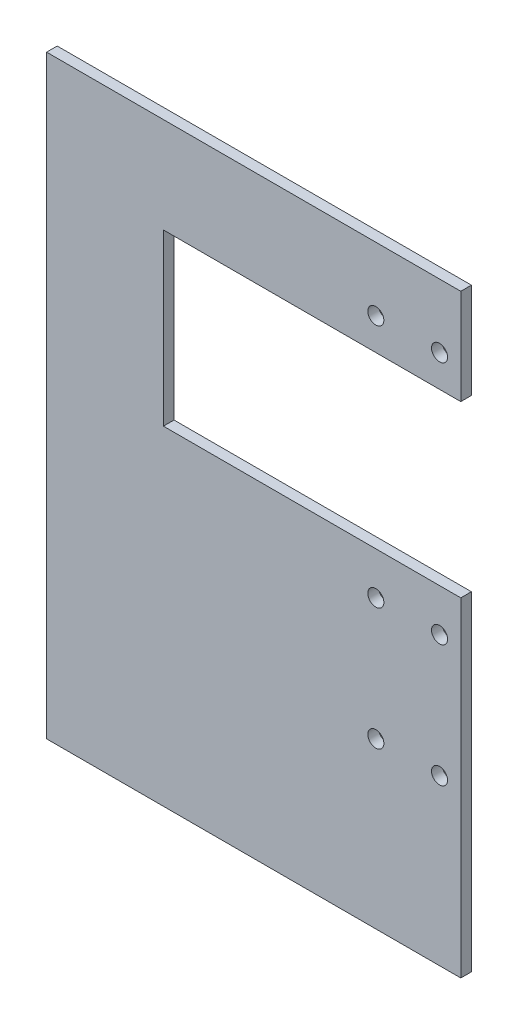
ISO-10303-21;
HEADER;
FILE_DESCRIPTION(('STEP AP214'),'2;1');
FILE_NAME('part.step','',(''),(''),'','','');
FILE_SCHEMA(('AUTOMOTIVE_DESIGN { 1 0 10303 214 1 1 1 1 }'));
ENDSEC;
DATA;
#1=APPLICATION_CONTEXT('core data for automotive mechanical design processes');
#2=APPLICATION_PROTOCOL_DEFINITION('international standard','automotive_design',2000,#1);
#3=PRODUCT_CONTEXT('',#1,'mechanical');
#4=PRODUCT('Part','Part','',(#3));
#5=PRODUCT_RELATED_PRODUCT_CATEGORY('part','',(#4));
#6=PRODUCT_DEFINITION_FORMATION('','',#4);
#7=PRODUCT_DEFINITION_CONTEXT('part definition',#1,'design');
#8=PRODUCT_DEFINITION('design','',#6,#7);
#9=PRODUCT_DEFINITION_SHAPE('','',#8);
#10=(LENGTH_UNIT() NAMED_UNIT(*) SI_UNIT(.MILLI.,.METRE.));
#11=(NAMED_UNIT(*) PLANE_ANGLE_UNIT() SI_UNIT($,.RADIAN.));
#12=(NAMED_UNIT(*) SI_UNIT($,.STERADIAN.) SOLID_ANGLE_UNIT());
#13=UNCERTAINTY_MEASURE_WITH_UNIT(LENGTH_MEASURE(1.E-05),#10,'distance_accuracy_value','');
#14=(GEOMETRIC_REPRESENTATION_CONTEXT(3) GLOBAL_UNCERTAINTY_ASSIGNED_CONTEXT((#13)) GLOBAL_UNIT_ASSIGNED_CONTEXT((#10,
#11,#12)) REPRESENTATION_CONTEXT('',''));
#15=CARTESIAN_POINT('',(0.,0.,0.));
#16=DIRECTION('',(0.,0.,1.));
#17=DIRECTION('',(1.,0.,0.));
#18=AXIS2_PLACEMENT_3D('',#15,#16,#17);
#19=CARTESIAN_POINT('',(0.,0.,0.));
#20=DIRECTION('',(0.,0.,1.));
#21=DIRECTION('',(1.,0.,0.));
#22=AXIS2_PLACEMENT_3D('',#19,#20,#21);
#23=PLANE('',#22);
#24=CARTESIAN_POINT('',(117.475,49.2124999999996,0.));
#25=DIRECTION('',(0.,0.,-1.));
#26=DIRECTION('',(-1.,0.,0.));
#27=AXIS2_PLACEMENT_3D('',#24,#25,#26);
#28=CIRCLE('',#27,2.40029999999999);
#29=CARTESIAN_POINT('',(115.0747,49.2124999999996,0.));
#30=VERTEX_POINT('',#29);
#31=EDGE_CURVE('E123',#30,#30,#28,.F.);
#32=ORIENTED_EDGE('',*,*,#31,.T.);
#33=EDGE_LOOP('',(#32));
#34=FACE_BOUND('',#33,.T.);
#35=CARTESIAN_POINT('',(98.425,49.2124999999997,0.));
#36=DIRECTION('',(0.,0.,-1.));
#37=DIRECTION('',(-1.,0.,0.));
#38=AXIS2_PLACEMENT_3D('',#35,#36,#37);
#39=CIRCLE('',#38,2.40029999999999);
#40=CARTESIAN_POINT('',(96.0247,49.2124999999997,0.));
#41=VERTEX_POINT('',#40);
#42=EDGE_CURVE('E20',#41,#41,#39,.F.);
#43=ORIENTED_EDGE('',*,*,#42,.T.);
#44=EDGE_LOOP('',(#43));
#45=FACE_BOUND('',#44,.T.);
#46=CARTESIAN_POINT('',(117.475,85.7250000000001,0.));
#47=DIRECTION('',(0.,0.,-1.));
#48=DIRECTION('',(-1.,0.,0.));
#49=AXIS2_PLACEMENT_3D('',#46,#47,#48);
#50=CIRCLE('',#49,2.40029999999999);
#51=CARTESIAN_POINT('',(115.0747,85.7250000000001,0.));
#52=VERTEX_POINT('',#51);
#53=EDGE_CURVE('E126',#52,#52,#50,.F.);
#54=ORIENTED_EDGE('',*,*,#53,.T.);
#55=EDGE_LOOP('',(#54));
#56=FACE_BOUND('',#55,.T.);
#57=CARTESIAN_POINT('',(98.425,85.7250000000001,0.));
#58=DIRECTION('',(0.,0.,-1.));
#59=DIRECTION('',(-1.,0.,0.));
#60=AXIS2_PLACEMENT_3D('',#57,#58,#59);
#61=CIRCLE('',#60,2.40029999999999);
#62=CARTESIAN_POINT('',(96.0247,85.7250000000001,0.));
#63=VERTEX_POINT('',#62);
#64=EDGE_CURVE('E134',#63,#63,#61,.F.);
#65=ORIENTED_EDGE('',*,*,#64,.T.);
#66=EDGE_LOOP('',(#65));
#67=FACE_BOUND('',#66,.T.);
#68=CARTESIAN_POINT('',(117.475,158.75,0.));
#69=DIRECTION('',(0.,0.,-1.));
#70=DIRECTION('',(-1.,0.,0.));
#71=AXIS2_PLACEMENT_3D('',#68,#69,#70);
#72=CIRCLE('',#71,2.40029999999999);
#73=CARTESIAN_POINT('',(115.0747,158.75,0.));
#74=VERTEX_POINT('',#73);
#75=EDGE_CURVE('E129',#74,#74,#72,.F.);
#76=ORIENTED_EDGE('',*,*,#75,.T.);
#77=EDGE_LOOP('',(#76));
#78=FACE_BOUND('',#77,.T.);
#79=CARTESIAN_POINT('',(98.425,158.75,0.));
#80=DIRECTION('',(0.,0.,-1.));
#81=DIRECTION('',(-1.,0.,0.));
#82=AXIS2_PLACEMENT_3D('',#79,#80,#81);
#83=CIRCLE('',#82,2.40029999999999);
#84=CARTESIAN_POINT('',(96.0247,158.75,0.));
#85=VERTEX_POINT('',#84);
#86=EDGE_CURVE('E93',#85,#85,#83,.F.);
#87=ORIENTED_EDGE('',*,*,#86,.T.);
#88=EDGE_LOOP('',(#87));
#89=FACE_BOUND('',#88,.T.);
#90=DIRECTION('',(0.,-1.,0.));
#91=VECTOR('',#90,1.);
#92=CARTESIAN_POINT('',(123.825,149.225,0.));
#93=LINE('',#92,#91);
#94=CARTESIAN_POINT('',(123.825,177.8,0.));
#95=VERTEX_POINT('',#94);
#96=CARTESIAN_POINT('',(123.825,149.225,0.));
#97=VERTEX_POINT('',#96);
#98=EDGE_CURVE('E132',#95,#97,#93,.T.);
#99=ORIENTED_EDGE('',*,*,#98,.T.);
#100=DIRECTION('',(1.,0.,0.));
#101=VECTOR('',#100,1.);
#102=CARTESIAN_POINT('',(123.825,149.225,0.));
#103=LINE('',#102,#101);
#104=CARTESIAN_POINT('',(34.925,149.225,0.));
#105=VERTEX_POINT('',#104);
#106=EDGE_CURVE('E340',#97,#105,#103,.F.);
#107=ORIENTED_EDGE('',*,*,#106,.T.);
#108=DIRECTION('',(0.,-1.,0.));
#109=VECTOR('',#108,1.);
#110=CARTESIAN_POINT('',(34.925,149.225,0.));
#111=LINE('',#110,#109);
#112=CARTESIAN_POINT('',(34.925,98.425,0.));
#113=VERTEX_POINT('',#112);
#114=EDGE_CURVE('E345',#105,#113,#111,.T.);
#115=ORIENTED_EDGE('',*,*,#114,.T.);
#116=DIRECTION('',(1.,0.,0.));
#117=VECTOR('',#116,1.);
#118=CARTESIAN_POINT('',(123.825,98.425,0.));
#119=LINE('',#118,#117);
#120=CARTESIAN_POINT('',(123.825,98.425,0.));
#121=VERTEX_POINT('',#120);
#122=EDGE_CURVE('E350',#113,#121,#119,.T.);
#123=ORIENTED_EDGE('',*,*,#122,.T.);
#124=DIRECTION('',(0.,1.,0.));
#125=VECTOR('',#124,1.);
#126=CARTESIAN_POINT('',(123.825,0.,0.));
#127=LINE('',#126,#125);
#128=CARTESIAN_POINT('',(123.825,0.,0.));
#129=VERTEX_POINT('',#128);
#130=EDGE_CURVE('E320',#121,#129,#127,.F.);
#131=ORIENTED_EDGE('',*,*,#130,.T.);
#132=DIRECTION('',(1.,0.,0.));
#133=VECTOR('',#132,1.);
#134=CARTESIAN_POINT('',(0.,0.,0.));
#135=LINE('',#134,#133);
#136=CARTESIAN_POINT('',(0.,0.,0.));
#137=VERTEX_POINT('',#136);
#138=EDGE_CURVE('E96',#129,#137,#135,.F.);
#139=ORIENTED_EDGE('',*,*,#138,.T.);
#140=DIRECTION('',(0.,1.,0.));
#141=VECTOR('',#140,1.);
#142=CARTESIAN_POINT('',(0.,98.425,0.));
#143=LINE('',#142,#141);
#144=CARTESIAN_POINT('',(0.,177.8,0.));
#145=VERTEX_POINT('',#144);
#146=EDGE_CURVE('E79',#137,#145,#143,.T.);
#147=ORIENTED_EDGE('',*,*,#146,.T.);
#148=DIRECTION('',(1.,0.,0.));
#149=VECTOR('',#148,1.);
#150=CARTESIAN_POINT('',(0.,177.8,0.));
#151=LINE('',#150,#149);
#152=EDGE_CURVE('E84',#145,#95,#151,.T.);
#153=ORIENTED_EDGE('',*,*,#152,.T.);
#154=EDGE_LOOP('',(#99,#107,#115,#123,#131,#139,#147,#153));
#155=FACE_BOUND('',#154,.T.);
#156=ADVANCED_FACE('F17',(#34,#45,#56,#67,#78,#89,#155),#23,.F.);
#157=CARTESIAN_POINT('',(98.425,49.2124999999997,3.175));
#158=DIRECTION('',(0.,0.,-1.));
#159=DIRECTION('',(-1.,0.,0.));
#160=AXIS2_PLACEMENT_3D('',#157,#158,#159);
#161=CYLINDRICAL_SURFACE('',#160,2.40029999999999);
#162=CARTESIAN_POINT('',(98.425,49.2124999999997,3.175));
#163=DIRECTION('',(0.,0.,-1.));
#164=DIRECTION('',(-1.,0.,0.));
#165=AXIS2_PLACEMENT_3D('',#162,#163,#164);
#166=CIRCLE('',#165,2.40029999999999);
#167=CARTESIAN_POINT('',(96.0247,49.2124999999997,3.175));
#168=VERTEX_POINT('',#167);
#169=EDGE_CURVE('E120',#168,#168,#166,.T.);
#170=ORIENTED_EDGE('',*,*,#169,.F.);
#171=EDGE_LOOP('',(#170));
#172=FACE_BOUND('',#171,.T.);
#173=ORIENTED_EDGE('',*,*,#42,.F.);
#174=EDGE_LOOP('',(#173));
#175=FACE_BOUND('',#174,.T.);
#176=ADVANCED_FACE('F143',(#172,#175),#161,.F.);
#177=CARTESIAN_POINT('',(98.425,85.7250000000001,3.175));
#178=DIRECTION('',(0.,0.,-1.));
#179=DIRECTION('',(-1.,0.,0.));
#180=AXIS2_PLACEMENT_3D('',#177,#178,#179);
#181=CYLINDRICAL_SURFACE('',#180,2.40029999999999);
#182=CARTESIAN_POINT('',(98.425,85.7250000000001,3.175));
#183=DIRECTION('',(0.,0.,-1.));
#184=DIRECTION('',(-1.,0.,0.));
#185=AXIS2_PLACEMENT_3D('',#182,#183,#184);
#186=CIRCLE('',#185,2.40029999999999);
#187=CARTESIAN_POINT('',(96.0247,85.7250000000001,3.175));
#188=VERTEX_POINT('',#187);
#189=EDGE_CURVE('E117',#188,#188,#186,.T.);
#190=ORIENTED_EDGE('',*,*,#189,.F.);
#191=EDGE_LOOP('',(#190));
#192=FACE_BOUND('',#191,.T.);
#193=ORIENTED_EDGE('',*,*,#64,.F.);
#194=EDGE_LOOP('',(#193));
#195=FACE_BOUND('',#194,.T.);
#196=ADVANCED_FACE('F145',(#192,#195),#181,.F.);
#197=CARTESIAN_POINT('',(98.425,158.75,3.175));
#198=DIRECTION('',(0.,0.,-1.));
#199=DIRECTION('',(-1.,0.,0.));
#200=AXIS2_PLACEMENT_3D('',#197,#198,#199);
#201=CYLINDRICAL_SURFACE('',#200,2.40029999999999);
#202=CARTESIAN_POINT('',(98.425,158.75,3.175));
#203=DIRECTION('',(0.,0.,-1.));
#204=DIRECTION('',(-1.,0.,0.));
#205=AXIS2_PLACEMENT_3D('',#202,#203,#204);
#206=CIRCLE('',#205,2.40029999999999);
#207=CARTESIAN_POINT('',(96.0247,158.75,3.175));
#208=VERTEX_POINT('',#207);
#209=EDGE_CURVE('E113',#208,#208,#206,.T.);
#210=ORIENTED_EDGE('',*,*,#209,.F.);
#211=EDGE_LOOP('',(#210));
#212=FACE_BOUND('',#211,.T.);
#213=ORIENTED_EDGE('',*,*,#86,.F.);
#214=EDGE_LOOP('',(#213));
#215=FACE_BOUND('',#214,.T.);
#216=ADVANCED_FACE('F152',(#212,#215),#201,.F.);
#217=CARTESIAN_POINT('',(0.,177.8,3.175));
#218=DIRECTION('',(0.,-1.,0.));
#219=DIRECTION('',(0.,0.,-1.));
#220=AXIS2_PLACEMENT_3D('',#217,#218,#219);
#221=PLANE('',#220);
#222=DIRECTION('',(0.,0.,-1.));
#223=VECTOR('',#222,1.);
#224=CARTESIAN_POINT('',(0.,177.8,3.175));
#225=LINE('',#224,#223);
#226=CARTESIAN_POINT('',(0.,177.8,3.175));
#227=VERTEX_POINT('',#226);
#228=EDGE_CURVE('E86',#145,#227,#225,.F.);
#229=ORIENTED_EDGE('',*,*,#228,.T.);
#230=DIRECTION('',(1.,0.,0.));
#231=VECTOR('',#230,1.);
#232=CARTESIAN_POINT('',(0.,177.8,3.175));
#233=LINE('',#232,#231);
#234=CARTESIAN_POINT('',(123.825,177.8,3.175));
#235=VERTEX_POINT('',#234);
#236=EDGE_CURVE('E116',#235,#227,#233,.F.);
#237=ORIENTED_EDGE('',*,*,#236,.F.);
#238=DIRECTION('',(0.,0.,1.));
#239=VECTOR('',#238,1.);
#240=CARTESIAN_POINT('',(123.825,177.8,3.175));
#241=LINE('',#240,#239);
#242=EDGE_CURVE('E89',#235,#95,#241,.F.);
#243=ORIENTED_EDGE('',*,*,#242,.T.);
#244=ORIENTED_EDGE('',*,*,#152,.F.);
#245=EDGE_LOOP('',(#229,#237,#243,#244));
#246=FACE_BOUND('',#245,.T.);
#247=ADVANCED_FACE('F85',(#246),#221,.F.);
#248=CARTESIAN_POINT('',(0.,98.425,3.175));
#249=DIRECTION('',(1.,0.,0.));
#250=DIRECTION('',(0.,0.,-1.));
#251=AXIS2_PLACEMENT_3D('',#248,#249,#250);
#252=PLANE('',#251);
#253=DIRECTION('',(0.,0.,1.));
#254=VECTOR('',#253,1.);
#255=CARTESIAN_POINT('',(0.,0.,3.175));
#256=LINE('',#255,#254);
#257=CARTESIAN_POINT('',(0.,0.,3.175));
#258=VERTEX_POINT('',#257);
#259=EDGE_CURVE('E98',#137,#258,#256,.T.);
#260=ORIENTED_EDGE('',*,*,#259,.T.);
#261=DIRECTION('',(0.,1.,0.));
#262=VECTOR('',#261,1.);
#263=CARTESIAN_POINT('',(0.,0.,3.175));
#264=LINE('',#263,#262);
#265=EDGE_CURVE('E102',#227,#258,#264,.F.);
#266=ORIENTED_EDGE('',*,*,#265,.F.);
#267=ORIENTED_EDGE('',*,*,#228,.F.);
#268=ORIENTED_EDGE('',*,*,#146,.F.);
#269=EDGE_LOOP('',(#260,#266,#267,#268));
#270=FACE_BOUND('',#269,.T.);
#271=ADVANCED_FACE('F100',(#270),#252,.F.);
#272=CARTESIAN_POINT('',(0.,0.,3.175));
#273=DIRECTION('',(0.,1.,0.));
#274=DIRECTION('',(0.,0.,1.));
#275=AXIS2_PLACEMENT_3D('',#272,#273,#274);
#276=PLANE('',#275);
#277=DIRECTION('',(0.,0.,1.));
#278=VECTOR('',#277,1.);
#279=CARTESIAN_POINT('',(123.825,0.,3.175));
#280=LINE('',#279,#278);
#281=CARTESIAN_POINT('',(123.825,0.,3.175));
#282=VERTEX_POINT('',#281);
#283=EDGE_CURVE('E316',#129,#282,#280,.T.);
#284=ORIENTED_EDGE('',*,*,#283,.T.);
#285=DIRECTION('',(1.,0.,0.));
#286=VECTOR('',#285,1.);
#287=CARTESIAN_POINT('',(0.,0.,3.175));
#288=LINE('',#287,#286);
#289=EDGE_CURVE('E319',#258,#282,#288,.T.);
#290=ORIENTED_EDGE('',*,*,#289,.F.);
#291=ORIENTED_EDGE('',*,*,#259,.F.);
#292=ORIENTED_EDGE('',*,*,#138,.F.);
#293=EDGE_LOOP('',(#284,#290,#291,#292));
#294=FACE_BOUND('',#293,.T.);
#295=ADVANCED_FACE('F195',(#294),#276,.F.);
#296=CARTESIAN_POINT('',(123.825,0.,3.175));
#297=DIRECTION('',(-1.,0.,0.));
#298=DIRECTION('',(0.,0.,1.));
#299=AXIS2_PLACEMENT_3D('',#296,#297,#298);
#300=PLANE('',#299);
#301=DIRECTION('',(0.,0.,-1.));
#302=VECTOR('',#301,1.);
#303=CARTESIAN_POINT('',(123.825,98.425,3.175));
#304=LINE('',#303,#302);
#305=CARTESIAN_POINT('',(123.825,98.425,3.175));
#306=VERTEX_POINT('',#305);
#307=EDGE_CURVE('E325',#121,#306,#304,.F.);
#308=ORIENTED_EDGE('',*,*,#307,.T.);
#309=DIRECTION('',(0.,1.,0.));
#310=VECTOR('',#309,1.);
#311=CARTESIAN_POINT('',(123.825,0.,3.175));
#312=LINE('',#311,#310);
#313=EDGE_CURVE('E323',#282,#306,#312,.T.);
#314=ORIENTED_EDGE('',*,*,#313,.F.);
#315=ORIENTED_EDGE('',*,*,#283,.F.);
#316=ORIENTED_EDGE('',*,*,#130,.F.);
#317=EDGE_LOOP('',(#308,#314,#315,#316));
#318=FACE_BOUND('',#317,.T.);
#319=ADVANCED_FACE('F191',(#318),#300,.F.);
#320=CARTESIAN_POINT('',(123.825,98.425,3.175));
#321=DIRECTION('',(0.,-1.,0.));
#322=DIRECTION('',(0.,0.,-1.));
#323=AXIS2_PLACEMENT_3D('',#320,#321,#322);
#324=PLANE('',#323);
#325=DIRECTION('',(0.,0.,1.));
#326=VECTOR('',#325,1.);
#327=CARTESIAN_POINT('',(34.925,98.425,3.175));
#328=LINE('',#327,#326);
#329=CARTESIAN_POINT('',(34.925,98.425,3.175));
#330=VERTEX_POINT('',#329);
#331=EDGE_CURVE('E348',#113,#330,#328,.T.);
#332=ORIENTED_EDGE('',*,*,#331,.T.);
#333=DIRECTION('',(1.,0.,0.));
#334=VECTOR('',#333,1.);
#335=CARTESIAN_POINT('',(0.,98.425,3.175));
#336=LINE('',#335,#334);
#337=EDGE_CURVE('E329',#306,#330,#336,.F.);
#338=ORIENTED_EDGE('',*,*,#337,.F.);
#339=ORIENTED_EDGE('',*,*,#307,.F.);
#340=ORIENTED_EDGE('',*,*,#122,.F.);
#341=EDGE_LOOP('',(#332,#338,#339,#340));
#342=FACE_BOUND('',#341,.T.);
#343=ADVANCED_FACE('F187',(#342),#324,.F.);
#344=CARTESIAN_POINT('',(34.925,149.225,3.175));
#345=DIRECTION('',(-1.,0.,0.));
#346=DIRECTION('',(0.,-1.,0.));
#347=AXIS2_PLACEMENT_3D('',#344,#345,#346);
#348=PLANE('',#347);
#349=DIRECTION('',(0.,0.,1.));
#350=VECTOR('',#349,1.);
#351=CARTESIAN_POINT('',(34.925,149.225,3.175));
#352=LINE('',#351,#350);
#353=CARTESIAN_POINT('',(34.925,149.225,3.175));
#354=VERTEX_POINT('',#353);
#355=EDGE_CURVE('E343',#105,#354,#352,.T.);
#356=ORIENTED_EDGE('',*,*,#355,.T.);
#357=DIRECTION('',(0.,1.,0.));
#358=VECTOR('',#357,1.);
#359=CARTESIAN_POINT('',(34.925,0.,3.175));
#360=LINE('',#359,#358);
#361=EDGE_CURVE('E358',#330,#354,#360,.T.);
#362=ORIENTED_EDGE('',*,*,#361,.F.);
#363=ORIENTED_EDGE('',*,*,#331,.F.);
#364=ORIENTED_EDGE('',*,*,#114,.F.);
#365=EDGE_LOOP('',(#356,#362,#363,#364));
#366=FACE_BOUND('',#365,.T.);
#367=ADVANCED_FACE('F184',(#366),#348,.F.);
#368=CARTESIAN_POINT('',(123.825,149.225,3.175));
#369=DIRECTION('',(0.,1.,0.));
#370=DIRECTION('',(0.,0.,1.));
#371=AXIS2_PLACEMENT_3D('',#368,#369,#370);
#372=PLANE('',#371);
#373=DIRECTION('',(0.,0.,1.));
#374=VECTOR('',#373,1.);
#375=CARTESIAN_POINT('',(123.825,149.225,3.175));
#376=LINE('',#375,#374);
#377=CARTESIAN_POINT('',(123.825,149.225,3.175));
#378=VERTEX_POINT('',#377);
#379=EDGE_CURVE('E35',#97,#378,#376,.T.);
#380=ORIENTED_EDGE('',*,*,#379,.T.);
#381=DIRECTION('',(1.,0.,0.));
#382=VECTOR('',#381,1.);
#383=CARTESIAN_POINT('',(0.,149.225,3.175));
#384=LINE('',#383,#382);
#385=EDGE_CURVE('E359',#354,#378,#384,.T.);
#386=ORIENTED_EDGE('',*,*,#385,.F.);
#387=ORIENTED_EDGE('',*,*,#355,.F.);
#388=ORIENTED_EDGE('',*,*,#106,.F.);
#389=EDGE_LOOP('',(#380,#386,#387,#388));
#390=FACE_BOUND('',#389,.T.);
#391=ADVANCED_FACE('F180',(#390),#372,.F.);
#392=CARTESIAN_POINT('',(123.825,149.225,3.175));
#393=DIRECTION('',(-1.,0.,0.));
#394=DIRECTION('',(0.,-1.,0.));
#395=AXIS2_PLACEMENT_3D('',#392,#393,#394);
#396=PLANE('',#395);
#397=ORIENTED_EDGE('',*,*,#242,.F.);
#398=DIRECTION('',(0.,1.,0.));
#399=VECTOR('',#398,1.);
#400=CARTESIAN_POINT('',(123.825,0.,3.175));
#401=LINE('',#400,#399);
#402=EDGE_CURVE('E112',#378,#235,#401,.T.);
#403=ORIENTED_EDGE('',*,*,#402,.F.);
#404=ORIENTED_EDGE('',*,*,#379,.F.);
#405=ORIENTED_EDGE('',*,*,#98,.F.);
#406=EDGE_LOOP('',(#397,#403,#404,#405));
#407=FACE_BOUND('',#406,.T.);
#408=ADVANCED_FACE('F176',(#407),#396,.F.);
#409=CARTESIAN_POINT('',(117.475,158.75,3.175));
#410=DIRECTION('',(0.,0.,-1.));
#411=DIRECTION('',(-1.,0.,0.));
#412=AXIS2_PLACEMENT_3D('',#409,#410,#411);
#413=CYLINDRICAL_SURFACE('',#412,2.40029999999999);
#414=CARTESIAN_POINT('',(117.475,158.75,3.175));
#415=DIRECTION('',(0.,0.,-1.));
#416=DIRECTION('',(-1.,0.,0.));
#417=AXIS2_PLACEMENT_3D('',#414,#415,#416);
#418=CIRCLE('',#417,2.40029999999999);
#419=CARTESIAN_POINT('',(115.0747,158.75,3.175));
#420=VERTEX_POINT('',#419);
#421=EDGE_CURVE('E109',#420,#420,#418,.T.);
#422=ORIENTED_EDGE('',*,*,#421,.F.);
#423=EDGE_LOOP('',(#422));
#424=FACE_BOUND('',#423,.T.);
#425=ORIENTED_EDGE('',*,*,#75,.F.);
#426=EDGE_LOOP('',(#425));
#427=FACE_BOUND('',#426,.T.);
#428=ADVANCED_FACE('F172',(#424,#427),#413,.F.);
#429=CARTESIAN_POINT('',(117.475,85.7250000000001,3.175));
#430=DIRECTION('',(0.,0.,-1.));
#431=DIRECTION('',(-1.,0.,0.));
#432=AXIS2_PLACEMENT_3D('',#429,#430,#431);
#433=CYLINDRICAL_SURFACE('',#432,2.40029999999999);
#434=CARTESIAN_POINT('',(117.475,85.7250000000001,3.175));
#435=DIRECTION('',(0.,0.,-1.));
#436=DIRECTION('',(-1.,0.,0.));
#437=AXIS2_PLACEMENT_3D('',#434,#435,#436);
#438=CIRCLE('',#437,2.40029999999999);
#439=CARTESIAN_POINT('',(115.0747,85.7250000000001,3.175));
#440=VERTEX_POINT('',#439);
#441=EDGE_CURVE('E26',#440,#440,#438,.T.);
#442=ORIENTED_EDGE('',*,*,#441,.F.);
#443=EDGE_LOOP('',(#442));
#444=FACE_BOUND('',#443,.T.);
#445=ORIENTED_EDGE('',*,*,#53,.F.);
#446=EDGE_LOOP('',(#445));
#447=FACE_BOUND('',#446,.T.);
#448=ADVANCED_FACE('F165',(#444,#447),#433,.F.);
#449=CARTESIAN_POINT('',(117.475,49.2124999999996,3.175));
#450=DIRECTION('',(0.,0.,-1.));
#451=DIRECTION('',(-1.,0.,0.));
#452=AXIS2_PLACEMENT_3D('',#449,#450,#451);
#453=CYLINDRICAL_SURFACE('',#452,2.40029999999999);
#454=CARTESIAN_POINT('',(117.475,49.2124999999996,3.175));
#455=DIRECTION('',(0.,0.,-1.));
#456=DIRECTION('',(-1.,0.,0.));
#457=AXIS2_PLACEMENT_3D('',#454,#455,#456);
#458=CIRCLE('',#457,2.40029999999999);
#459=CARTESIAN_POINT('',(115.0747,49.2124999999996,3.175));
#460=VERTEX_POINT('',#459);
#461=EDGE_CURVE('E11',#460,#460,#458,.T.);
#462=ORIENTED_EDGE('',*,*,#461,.F.);
#463=EDGE_LOOP('',(#462));
#464=FACE_BOUND('',#463,.T.);
#465=ORIENTED_EDGE('',*,*,#31,.F.);
#466=EDGE_LOOP('',(#465));
#467=FACE_BOUND('',#466,.T.);
#468=ADVANCED_FACE('F159',(#464,#467),#453,.F.);
#469=CARTESIAN_POINT('',(0.,0.,3.175));
#470=DIRECTION('',(0.,0.,1.));
#471=DIRECTION('',(1.,0.,0.));
#472=AXIS2_PLACEMENT_3D('',#469,#470,#471);
#473=PLANE('',#472);
#474=ORIENTED_EDGE('',*,*,#461,.T.);
#475=EDGE_LOOP('',(#474));
#476=FACE_BOUND('',#475,.T.);
#477=ORIENTED_EDGE('',*,*,#441,.T.);
#478=EDGE_LOOP('',(#477));
#479=FACE_BOUND('',#478,.T.);
#480=ORIENTED_EDGE('',*,*,#421,.T.);
#481=EDGE_LOOP('',(#480));
#482=FACE_BOUND('',#481,.T.);
#483=ORIENTED_EDGE('',*,*,#385,.T.);
#484=ORIENTED_EDGE('',*,*,#402,.T.);
#485=ORIENTED_EDGE('',*,*,#236,.T.);
#486=ORIENTED_EDGE('',*,*,#265,.T.);
#487=ORIENTED_EDGE('',*,*,#289,.T.);
#488=ORIENTED_EDGE('',*,*,#313,.T.);
#489=ORIENTED_EDGE('',*,*,#337,.T.);
#490=ORIENTED_EDGE('',*,*,#361,.T.);
#491=EDGE_LOOP('',(#483,#484,#485,#486,#487,#488,#489,#490));
#492=FACE_BOUND('',#491,.T.);
#493=ORIENTED_EDGE('',*,*,#209,.T.);
#494=EDGE_LOOP('',(#493));
#495=FACE_BOUND('',#494,.T.);
#496=ORIENTED_EDGE('',*,*,#189,.T.);
#497=EDGE_LOOP('',(#496));
#498=FACE_BOUND('',#497,.T.);
#499=ORIENTED_EDGE('',*,*,#169,.T.);
#500=EDGE_LOOP('',(#499));
#501=FACE_BOUND('',#500,.T.);
#502=ADVANCED_FACE('F157',(#476,#479,#482,#492,#495,#498,#501),#473,.T.);
#503=CLOSED_SHELL('',(#156,#176,#196,#216,#247,#271,#295,#319,#343,#367,#391,#408,#428,#448,
#468,#502));
#504=MANIFOLD_SOLID_BREP('B1',#503);
#505=ADVANCED_BREP_SHAPE_REPRESENTATION('',(#18,#504),#14);
#506=SHAPE_DEFINITION_REPRESENTATION(#9,#505);
ENDSEC;
END-ISO-10303-21;
